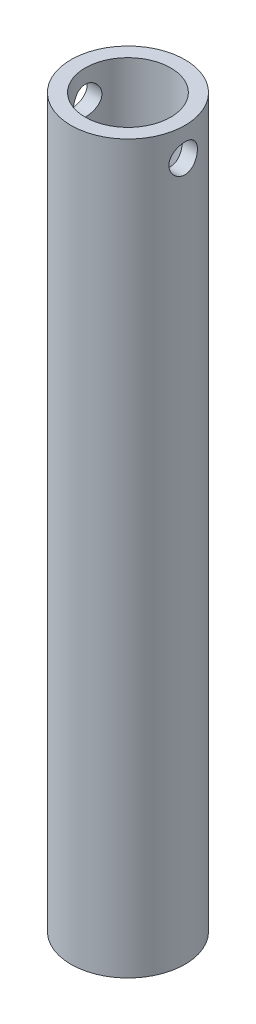
ISO-10303-21;
HEADER;
FILE_DESCRIPTION(('STEP AP214'),'2;1');
FILE_NAME('part.step','',(''),(''),'','','');
FILE_SCHEMA(('AUTOMOTIVE_DESIGN { 1 0 10303 214 1 1 1 1 }'));
ENDSEC;
DATA;
#1=APPLICATION_CONTEXT('core data for automotive mechanical design processes');
#2=APPLICATION_PROTOCOL_DEFINITION('international standard','automotive_design',2000,#1);
#3=PRODUCT_CONTEXT('',#1,'mechanical');
#4=PRODUCT('Part','Part','',(#3));
#5=PRODUCT_RELATED_PRODUCT_CATEGORY('part','',(#4));
#6=PRODUCT_DEFINITION_FORMATION('','',#4);
#7=PRODUCT_DEFINITION_CONTEXT('part definition',#1,'design');
#8=PRODUCT_DEFINITION('design','',#6,#7);
#9=PRODUCT_DEFINITION_SHAPE('','',#8);
#10=(LENGTH_UNIT() NAMED_UNIT(*) SI_UNIT(.MILLI.,.METRE.));
#11=(NAMED_UNIT(*) PLANE_ANGLE_UNIT() SI_UNIT($,.RADIAN.));
#12=(NAMED_UNIT(*) SI_UNIT($,.STERADIAN.) SOLID_ANGLE_UNIT());
#13=UNCERTAINTY_MEASURE_WITH_UNIT(LENGTH_MEASURE(1.E-05),#10,'distance_accuracy_value','');
#14=(GEOMETRIC_REPRESENTATION_CONTEXT(3) GLOBAL_UNCERTAINTY_ASSIGNED_CONTEXT((#13)) GLOBAL_UNIT_ASSIGNED_CONTEXT((#10,
#11,#12)) REPRESENTATION_CONTEXT('',''));
#15=CARTESIAN_POINT('',(0.,0.,0.));
#16=DIRECTION('',(0.,0.,1.));
#17=DIRECTION('',(1.,0.,0.));
#18=AXIS2_PLACEMENT_3D('',#15,#16,#17);
#19=CARTESIAN_POINT('',(0.,161.925,0.));
#20=DIRECTION('',(0.,1.,0.));
#21=DIRECTION('',(0.,0.,1.));
#22=AXIS2_PLACEMENT_3D('',#19,#20,#21);
#23=PLANE('',#22);
#24=CARTESIAN_POINT('',(0.,161.925,0.));
#25=DIRECTION('',(0.,1.,0.));
#26=DIRECTION('',(0.,0.,1.));
#27=AXIS2_PLACEMENT_3D('',#24,#25,#26);
#28=CIRCLE('',#27,12.7);
#29=CARTESIAN_POINT('',(0.,161.925,12.7));
#30=VERTEX_POINT('',#29);
#31=EDGE_CURVE('E10',#30,#30,#28,.T.);
#32=ORIENTED_EDGE('',*,*,#31,.T.);
#33=EDGE_LOOP('',(#32));
#34=FACE_BOUND('',#33,.T.);
#35=CARTESIAN_POINT('',(0.,161.925,0.));
#36=DIRECTION('',(0.,1.,0.));
#37=DIRECTION('',(0.,0.,1.));
#38=AXIS2_PLACEMENT_3D('',#35,#36,#37);
#39=CIRCLE('',#38,9.525);
#40=CARTESIAN_POINT('',(0.,161.925,9.525));
#41=VERTEX_POINT('',#40);
#42=EDGE_CURVE('E49',#41,#41,#39,.T.);
#43=ORIENTED_EDGE('',*,*,#42,.F.);
#44=EDGE_LOOP('',(#43));
#45=FACE_BOUND('',#44,.T.);
#46=ADVANCED_FACE('F31',(#34,#45),#23,.T.);
#47=CARTESIAN_POINT('',(0.,0.,0.));
#48=DIRECTION('',(0.,1.,0.));
#49=DIRECTION('',(0.,0.,1.));
#50=AXIS2_PLACEMENT_3D('',#47,#48,#49);
#51=PLANE('',#50);
#52=CARTESIAN_POINT('',(0.,0.,0.));
#53=DIRECTION('',(0.,1.,0.));
#54=DIRECTION('',(0.,0.,1.));
#55=AXIS2_PLACEMENT_3D('',#52,#53,#54);
#56=CIRCLE('',#55,12.7);
#57=CARTESIAN_POINT('',(0.,0.,12.7));
#58=VERTEX_POINT('',#57);
#59=EDGE_CURVE('E44',#58,#58,#56,.T.);
#60=ORIENTED_EDGE('',*,*,#59,.F.);
#61=EDGE_LOOP('',(#60));
#62=FACE_BOUND('',#61,.T.);
#63=CARTESIAN_POINT('',(0.,0.,0.));
#64=DIRECTION('',(0.,1.,0.));
#65=DIRECTION('',(0.,0.,1.));
#66=AXIS2_PLACEMENT_3D('',#63,#64,#65);
#67=CIRCLE('',#66,9.525);
#68=CARTESIAN_POINT('',(0.,0.,9.525));
#69=VERTEX_POINT('',#68);
#70=EDGE_CURVE('E52',#69,#69,#67,.T.);
#71=ORIENTED_EDGE('',*,*,#70,.T.);
#72=EDGE_LOOP('',(#71));
#73=FACE_BOUND('',#72,.T.);
#74=ADVANCED_FACE('F85',(#62,#73),#51,.F.);
#75=CARTESIAN_POINT('',(0.,161.925,0.));
#76=DIRECTION('',(0.,-1.,0.));
#77=DIRECTION('',(0.,0.,-1.));
#78=AXIS2_PLACEMENT_3D('',#75,#76,#77);
#79=CYLINDRICAL_SURFACE('',#78,12.7);
#80=CARTESIAN_POINT('',(-12.7,152.4,0.));
#81=CARTESIAN_POINT('',(-12.6999970338729,152.400004922812,-0.175421054350931));
#82=CARTESIAN_POINT('',(-12.6963292371237,152.414587115805,-0.350897100741782));
#83=CARTESIAN_POINT('',(-12.6820530760661,152.472443236933,-0.696820051980961));
#84=CARTESIAN_POINT('',(-12.6714407780562,152.515733426855,-0.867264049209733));
#85=CARTESIAN_POINT('',(-12.6444507573613,152.629529753161,-1.19807751278646));
#86=CARTESIAN_POINT('',(-12.6280799601569,152.700003207281,-1.35845880926017));
#87=CARTESIAN_POINT('',(-12.591316443928,152.866050608928,-1.66512267919771));
#88=CARTESIAN_POINT('',(-12.5709235892463,152.961625403118,-1.81140477687155));
#89=CARTESIAN_POINT('',(-12.5278602543575,153.177241671435,-2.08873074612027));
#90=CARTESIAN_POINT('',(-12.5051546346353,153.297702833663,-2.2194428772959));
#91=CARTESIAN_POINT('',(-12.4602582924963,153.558773833724,-2.45903522924702));
#92=CARTESIAN_POINT('',(-12.4380676284689,153.699385943571,-2.56791298487579));
#93=CARTESIAN_POINT('',(-12.3963594189446,153.999343229927,-2.76230618225783));
#94=CARTESIAN_POINT('',(-12.3768864828385,154.158935671878,-2.84745052370821));
#95=CARTESIAN_POINT('',(-12.343330973648,154.490734138014,-2.9895734564324));
#96=CARTESIAN_POINT('',(-12.3292475388652,154.662938140553,-3.04655655068163));
#97=CARTESIAN_POINT('',(-12.3084267567388,155.01142373786,-3.12960773790342));
#98=CARTESIAN_POINT('',(-12.3015478927701,155.187554529947,-3.15627230130284));
#99=CARTESIAN_POINT('',(-12.2954915053947,155.541913471049,-3.17978742389056));
#100=CARTESIAN_POINT('',(-12.2963127290578,155.720141274132,-3.176642833515));
#101=CARTESIAN_POINT('',(-12.3054365167726,156.069063459728,-3.14110481048737));
#102=CARTESIAN_POINT('',(-12.3135572669877,156.239835732102,-3.1094221534035));
#103=CARTESIAN_POINT('',(-12.3360753547043,156.573560891095,-3.01884119561133));
#104=CARTESIAN_POINT('',(-12.3504731393489,156.736513219745,-2.95994095604687));
#105=CARTESIAN_POINT('',(-12.3840899110031,157.051878801067,-2.81599106163371));
#106=CARTESIAN_POINT('',(-12.4033560981111,157.204169063621,-2.73068344564301));
#107=CARTESIAN_POINT('',(-12.4445122129068,157.492527935652,-2.53652078423163));
#108=CARTESIAN_POINT('',(-12.4664025994163,157.628593700076,-2.42766161831203));
#109=CARTESIAN_POINT('',(-12.5111061380944,157.884714319886,-2.18580424890856));
#110=CARTESIAN_POINT('',(-12.533927803951,158.004202003963,-2.05220624645105));
#111=CARTESIAN_POINT('',(-12.5773596047503,158.219184963215,-1.76659522538281));
#112=CARTESIAN_POINT('',(-12.5979696721291,158.314679505525,-1.6145816444818));
#113=CARTESIAN_POINT('',(-12.6347586626604,158.479173740842,-1.29564529770894));
#114=CARTESIAN_POINT('',(-12.6509221227036,158.548081303539,-1.12867311562491));
#115=CARTESIAN_POINT('',(-12.676884242985,158.656691630419,-0.785020883902428));
#116=CARTESIAN_POINT('',(-12.6866841206814,158.696399981085,-0.608342698201852));
#117=CARTESIAN_POINT('',(-12.6986347345774,158.744618513766,-0.255142937325549));
#118=CARTESIAN_POINT('',(-12.7009747992585,158.753901071859,-0.0787330573083703));
#119=CARTESIAN_POINT('',(-12.6982813685726,158.743122945649,0.273119584996531));
#120=CARTESIAN_POINT('',(-12.6932485369526,158.723064902742,0.448562432914398));
#121=CARTESIAN_POINT('',(-12.6764961338622,158.654811577238,0.790816868910241));
#122=CARTESIAN_POINT('',(-12.6648767569325,158.607037658974,0.957717835150525));
#123=CARTESIAN_POINT('',(-12.6362609570897,158.485190005473,1.28112793569116));
#124=CARTESIAN_POINT('',(-12.6192639911647,158.411113614204,1.43763601861911));
#125=CARTESIAN_POINT('',(-12.5813250177716,158.237266860549,1.73889063454314));
#126=CARTESIAN_POINT('',(-12.5603183592593,158.137063895427,1.88337918521904));
#127=CARTESIAN_POINT('',(-12.5167921111412,157.914361359713,2.15376466554501));
#128=CARTESIAN_POINT('',(-12.4942722608556,157.791857941143,2.27965837982672));
#129=CARTESIAN_POINT('',(-12.4495762556412,157.524445849547,2.51246336908675));
#130=CARTESIAN_POINT('',(-12.4274221051899,157.379061028651,2.6188328531313));
#131=CARTESIAN_POINT('',(-12.3865825924258,157.072049257042,2.80566443991221));
#132=CARTESIAN_POINT('',(-12.3678970761538,156.910423027713,2.88612769264177));
#133=CARTESIAN_POINT('',(-12.3363163381503,156.576382887573,3.0182638402854));
#134=CARTESIAN_POINT('',(-12.3233869021911,156.404039853404,3.07010730622842));
#135=CARTESIAN_POINT('',(-12.3047494152553,156.052711266541,3.1439816468797));
#136=CARTESIAN_POINT('',(-12.299039785006,155.873727175344,3.16601904149253));
#137=CARTESIAN_POINT('',(-12.2956087422145,155.51971049948,3.17931501621074));
#138=CARTESIAN_POINT('',(-12.2976625750886,155.344712095613,3.17143955029538));
#139=CARTESIAN_POINT('',(-12.3090074061494,154.998623435624,3.1271152390873));
#140=CARTESIAN_POINT('',(-12.3182982588945,154.827533101033,3.09066696801937));
#141=CARTESIAN_POINT('',(-12.3429450180984,154.495058761656,2.99070462615689));
#142=CARTESIAN_POINT('',(-12.3582644892528,154.333623037245,2.92735297324092));
#143=CARTESIAN_POINT('',(-12.3932474960913,154.023556606586,2.77551073379659));
#144=CARTESIAN_POINT('',(-12.4129116342002,153.874927680087,2.68701666057214));
#145=CARTESIAN_POINT('',(-12.4550092586011,153.590509368613,2.48468673461549));
#146=CARTESIAN_POINT('',(-12.4775016056118,153.455156061253,2.37025002816432));
#147=CARTESIAN_POINT('',(-12.5223699100401,153.205292088516,2.12045416901819));
#148=CARTESIAN_POINT('',(-12.5447458385544,153.090786379594,1.98509005500273));
#149=CARTESIAN_POINT('',(-12.5873437112106,152.883846063538,1.69432305852049));
#150=CARTESIAN_POINT('',(-12.6075193062447,152.791848734395,1.53860166056968));
#151=CARTESIAN_POINT('',(-12.6429542453062,152.635484536776,1.21341315929717));
#152=CARTESIAN_POINT('',(-12.6582171100619,152.571097869961,1.04395600927443));
#153=CARTESIAN_POINT('',(-12.6798505941374,152.481339625802,0.729001702698686));
#154=CARTESIAN_POINT('',(-12.6873547169486,152.450903202204,0.58500469508875));
#155=CARTESIAN_POINT('',(-12.6974304774096,152.410232086,0.29401785141847));
#156=CARTESIAN_POINT('',(-12.7000024860439,152.39999587397,0.147028241296873));
#157=CARTESIAN_POINT('',(-12.7,152.4,0.));
#158=B_SPLINE_CURVE_WITH_KNOTS('',3,(#80,#81,#82,#83,#84,#85,#86,#87,#88,#89,#90,#91,#92,#93,
#94,#95,#96,#97,#98,#99,#100,#101,#102,#103,#104,#105,#106,#107,#108,#109,#110,#111,#112,#113,
#114,#115,#116,#117,#118,#119,#120,#121,#122,#123,#124,#125,#126,#127,#128,#129,#130,#131,#132,
#133,#134,#135,#136,#137,#138,#139,#140,#141,#142,#143,#144,#145,#146,#147,#148,#149,#150,#151,
#152,#153,#154,#155,#156,#157),.UNSPECIFIED.,.T.,.F.,(4,2,2,2,2,2,2,2,2,2,2,2,2,2,2,2,2,2,2,2,2,
2,2,2,2,2,2,2,2,2,2,2,2,2,2,2,2,2,4),(0.,0.525724358065498,1.05174676993359,1.57713870983893,
2.10254837335841,2.63767221675278,3.17285644277796,3.7159913730529,4.25903942808498,
4.79120824630598,5.3232904734557,5.84247618671886,6.36169889010144,6.8861628400674,
7.41071862276906,7.95023177058124,8.48976139571985,9.0311441807632,9.57242335981323,
10.09985087283,10.6272309069567,11.1467958106174,11.6664131950588,12.1952509368702,
12.7241800170733,13.266092111565,13.8079801469349,14.34660272276,14.885107458967,
15.4081433519175,15.9311687337377,16.4510804786766,16.971064359066,17.5046127008448,
18.0382877269755,18.5816279265762,19.1245778677202,19.5652441424438,20.005877269746),.UNSPECIFIED.);
#159=CARTESIAN_POINT('',(-12.7,152.4,0.));
#160=VERTEX_POINT('',#159);
#161=EDGE_CURVE('E75',#160,#160,#158,.T.);
#162=ORIENTED_EDGE('',*,*,#161,.T.);
#163=EDGE_LOOP('',(#162));
#164=FACE_BOUND('',#163,.T.);
#165=CARTESIAN_POINT('',(12.2967221242086,155.575,-3.175));
#166=CARTESIAN_POINT('',(12.2967254711158,155.399675546323,-3.1749950198132));
#167=CARTESIAN_POINT('',(12.3005126863854,155.224295978678,-3.16042833178201));
#168=CARTESIAN_POINT('',(12.3152136473056,154.87857317572,-3.10263936933901));
#169=CARTESIAN_POINT('',(12.3261315404947,154.708232931825,-3.05940041756247));
#170=CARTESIAN_POINT('',(12.3537818023711,154.377639506502,-2.94575382353269));
#171=CARTESIAN_POINT('',(12.3705066621688,154.21737361266,-2.8753812543752));
#172=CARTESIAN_POINT('',(12.4078770387652,153.910905217274,-2.70957184940195));
#173=CARTESIAN_POINT('',(12.4285227220068,153.764703313158,-2.61413394947206));
#174=CARTESIAN_POINT('',(12.4719170977164,153.487295710517,-2.39865970268607));
#175=CARTESIAN_POINT('',(12.4946993898125,153.356445127555,-2.27817284738413));
#176=CARTESIAN_POINT('',(12.5395085190442,153.116583029162,-2.01699122140783));
#177=CARTESIAN_POINT('',(12.5615352853931,153.00757355546,-1.87629456360899));
#178=CARTESIAN_POINT('',(12.6027232771114,152.813035156108,-1.57625440537027));
#179=CARTESIAN_POINT('',(12.6218402299875,152.727855087035,-1.4166781117678));
#180=CARTESIAN_POINT('',(12.65467131146,152.585661751926,-1.08491424405179));
#181=CARTESIAN_POINT('',(12.6683862371462,152.528644330067,-0.912728534955745));
#182=CARTESIAN_POINT('',(12.6886304373719,152.445532250085,-0.564335623617766));
#183=CARTESIAN_POINT('',(12.6952996518228,152.418834551705,-0.388280553827183));
#184=CARTESIAN_POINT('',(12.7011886451627,152.39522685832,-0.0340726004637068));
#185=CARTESIAN_POINT('',(12.7004095254281,152.398312459294,0.144079969063354));
#186=CARTESIAN_POINT('',(12.6915938059099,152.433750059818,0.493243384772338));
#187=CARTESIAN_POINT('',(12.6837186297291,152.465451132818,0.664324984533399));
#188=CARTESIAN_POINT('',(12.6617836238657,152.556173512962,0.998658935538464));
#189=CARTESIAN_POINT('',(12.6477234649603,152.615196274429,1.16191086950115));
#190=CARTESIAN_POINT('',(12.6147513732012,152.759413264773,1.47766628361824));
#191=CARTESIAN_POINT('',(12.5957967501266,152.84483914672,1.63005931850867));
#192=CARTESIAN_POINT('',(12.5550917783831,153.039261712478,1.91857510093107));
#193=CARTESIAN_POINT('',(12.5333409435886,153.148262497072,2.05469501139649));
#194=CARTESIAN_POINT('',(12.4887191648708,153.390230102318,2.31068256139474));
#195=CARTESIAN_POINT('',(12.4658338379713,153.523765713282,2.43001063106375));
#196=CARTESIAN_POINT('',(12.4220610526701,153.809191966396,2.6446999936826));
#197=CARTESIAN_POINT('',(12.4011736876753,153.961083465954,2.74006016644614));
#198=CARTESIAN_POINT('',(12.3637103097323,154.279968343369,2.90445230964672));
#199=CARTESIAN_POINT('',(12.347155693206,154.447031377497,2.97335437513118));
#200=CARTESIAN_POINT('',(12.3205067298881,154.790883544458,3.08192684552051));
#201=CARTESIAN_POINT('',(12.3104110007027,154.96767058726,3.12160350580598));
#202=CARTESIAN_POINT('',(12.2981130212947,155.320948566943,3.16970364110572));
#203=CARTESIAN_POINT('',(12.2957093300071,155.497323997543,3.17892490187728));
#204=CARTESIAN_POINT('',(12.2985192607316,155.849093859463,3.16803657795425));
#205=CARTESIAN_POINT('',(12.3037321815428,156.024488379596,3.14792969326924));
#206=CARTESIAN_POINT('',(12.3209949412092,156.366355116485,3.07965533920158));
#207=CARTESIAN_POINT('',(12.3329315220802,156.532926362743,3.03195236671801));
#208=CARTESIAN_POINT('',(12.3621891219376,156.855707951474,2.91035496372148));
#209=CARTESIAN_POINT('',(12.3795107787294,157.011917064001,2.83645743059487));
#210=CARTESIAN_POINT('',(12.418010941113,157.312920422891,2.66289874827947));
#211=CARTESIAN_POINT('',(12.439258441312,157.457430626855,2.56276062737125));
#212=CARTESIAN_POINT('',(12.4830469550031,157.727889220758,2.34016643006687));
#213=CARTESIAN_POINT('',(12.5055881806495,157.853834554146,2.21770668600725));
#214=CARTESIAN_POINT('',(12.5501070185035,158.086820024065,1.95028413912649));
#215=CARTESIAN_POINT('',(12.5720564161859,158.193308279437,1.80483494928779));
#216=CARTESIAN_POINT('',(12.6123346509939,158.380348551028,1.49765601755557));
#217=CARTESIAN_POINT('',(12.6306636769502,158.460901920092,1.33592712544033));
#218=CARTESIAN_POINT('',(12.6615204698767,158.59308646385,1.0018972904962));
#219=CARTESIAN_POINT('',(12.6740898412846,158.644925641161,0.829682684763512));
#220=CARTESIAN_POINT('',(12.6921932261265,158.718834624953,0.478630489012201));
#221=CARTESIAN_POINT('',(12.6977285972965,158.740910176599,0.299794184005929));
#222=CARTESIAN_POINT('',(12.7010848787296,158.754342096902,-0.0542401964575578));
#223=CARTESIAN_POINT('',(12.6991103294396,158.746512926378,-0.229405900617125));
#224=CARTESIAN_POINT('',(12.6881222125238,158.70222314834,-0.57584180111684));
#225=CARTESIAN_POINT('',(12.6791088542401,158.665763392333,-0.747112113154457));
#226=CARTESIAN_POINT('',(12.655087493111,158.565684202227,-1.08004303817217));
#227=CARTESIAN_POINT('',(12.640112022951,158.502212035727,-1.24175042029425));
#228=CARTESIAN_POINT('',(12.6057434230086,158.350043411613,-1.55231164340717));
#229=CARTESIAN_POINT('',(12.5863497364056,158.261343774271,-1.7011638610184));
#230=CARTESIAN_POINT('',(12.5446551773491,158.058754132062,-1.985651122744));
#231=CARTESIAN_POINT('',(12.5222957878978,157.94431154628,-2.12088408784723));
#232=CARTESIAN_POINT('',(12.4774531075658,157.694557444972,-2.37050268936839));
#233=CARTESIAN_POINT('',(12.4549697867118,157.559240646347,-2.48488303211818));
#234=CARTESIAN_POINT('',(12.4119473580947,157.268540509948,-2.69164443404807));
#235=CARTESIAN_POINT('',(12.3914523466269,157.112829908315,-2.78357526664701));
#236=CARTESIAN_POINT('',(12.3553205869608,156.787673819647,-2.93981789665887));
#237=CARTESIAN_POINT('',(12.3396803064045,156.618238432652,-3.00414978846309));
#238=CARTESIAN_POINT('',(12.3174731028359,156.303417987423,-3.09379152821294));
#239=CARTESIAN_POINT('',(12.3097500503611,156.159539203074,-3.12417831664509));
#240=CARTESIAN_POINT('',(12.2993733749982,155.868786340932,-3.16478377891537));
#241=CARTESIAN_POINT('',(12.2967193196792,155.721912519724,-3.1750041731303));
#242=CARTESIAN_POINT('',(12.2967221242086,155.575,-3.175));
#243=B_SPLINE_CURVE_WITH_KNOTS('',3,(#165,#166,#167,#168,#169,#170,#171,#172,#173,#174,#175,
#176,#177,#178,#179,#180,#181,#182,#183,#184,#185,#186,#187,#188,#189,#190,#191,#192,#193,#194,
#195,#196,#197,#198,#199,#200,#201,#202,#203,#204,#205,#206,#207,#208,#209,#210,#211,#212,#213,
#214,#215,#216,#217,#218,#219,#220,#221,#222,#223,#224,#225,#226,#227,#228,#229,#230,#231,#232,
#233,#234,#235,#236,#237,#238,#239,#240,#241,#242),.UNSPECIFIED.,.T.,.F.,(4,2,2,2,2,2,2,2,2,2,2,
2,2,2,2,2,2,2,2,2,2,2,2,2,2,2,2,2,2,2,2,2,2,2,2,2,2,2,4),(0.,0.525433851004907,1.05117359161441,
1.57623602350084,2.10132074979461,2.63682421825082,3.1723777227943,3.71540400425359,
4.25835013005809,4.79029713764091,5.32216548805846,5.84223193614963,6.36232607040479,
6.88711950303145,7.41200429545521,7.95109492546329,8.4902107462375,9.03194068650673,
9.57355464164526,10.1008633995054,10.6281236152971,11.1467570436797,11.6654519221148,
12.1943221424741,12.7232793399029,13.2654717033224,13.8076357797011,14.3458193247108,
14.8838989712076,15.4074297658815,15.9309449907505,16.4516419323711,16.9724045329363,
17.5056431266551,18.0390169009448,18.5823412615974,19.1252693614627,19.5655924052587,
20.0058778838705),.UNSPECIFIED.);
#244=CARTESIAN_POINT('',(12.2967221242086,155.575,-3.175));
#245=VERTEX_POINT('',#244);
#246=EDGE_CURVE('E71',#245,#245,#243,.T.);
#247=ORIENTED_EDGE('',*,*,#246,.T.);
#248=EDGE_LOOP('',(#247));
#249=FACE_BOUND('',#248,.T.);
#250=ORIENTED_EDGE('',*,*,#31,.F.);
#251=EDGE_LOOP('',(#250));
#252=FACE_BOUND('',#251,.T.);
#253=ORIENTED_EDGE('',*,*,#59,.T.);
#254=EDGE_LOOP('',(#253));
#255=FACE_BOUND('',#254,.T.);
#256=ADVANCED_FACE('F33',(#164,#249,#252,#255),#79,.T.);
#257=CARTESIAN_POINT('',(0.,161.925,0.));
#258=DIRECTION('',(0.,-1.,0.));
#259=DIRECTION('',(0.,0.,-1.));
#260=AXIS2_PLACEMENT_3D('',#257,#258,#259);
#261=CYLINDRICAL_SURFACE('',#260,9.525);
#262=CARTESIAN_POINT('',(-8.98025612106915,155.575,-3.175));
#263=CARTESIAN_POINT('',(-8.98025555134128,155.747936455105,-3.17500081898399));
#264=CARTESIAN_POINT('',(-8.98530617498472,155.92086798944,-3.16082293820153));
#265=CARTESIAN_POINT('',(-9.00485797707984,156.261607786657,-3.10467734311196));
#266=CARTESIAN_POINT('',(-9.01936071226449,156.429415200845,-3.06270505113466));
#267=CARTESIAN_POINT('',(-9.05599546711913,156.754915385266,-2.95260866704957));
#268=CARTESIAN_POINT('',(-9.07811252608946,156.912627275981,-2.8845358279553));
#269=CARTESIAN_POINT('',(-9.12746212382781,157.21444315414,-2.72434567030138));
#270=CARTESIAN_POINT('',(-9.15469579088969,157.358544129608,-2.63222304663107));
#271=CARTESIAN_POINT('',(-9.21240503868728,157.634685880424,-2.42268738995613));
#272=CARTESIAN_POINT('',(-9.24296141131745,157.766116486033,-2.30449228387489));
#273=CARTESIAN_POINT('',(-9.30319020743184,158.007706593888,-2.0478358434057));
#274=CARTESIAN_POINT('',(-9.33286248831953,158.117862680274,-1.90937126079128));
#275=CARTESIAN_POINT('',(-9.38891527476712,158.316545499021,-1.61164431278889));
#276=CARTESIAN_POINT('',(-9.41518969452598,158.404432906712,-1.45193356813785));
#277=CARTESIAN_POINT('',(-9.46053437997871,158.55185328278,-1.1189691329852));
#278=CARTESIAN_POINT('',(-9.47960658694531,158.611393892837,-0.945719107056871));
#279=CARTESIAN_POINT('',(-9.50782564496303,158.698361338458,-0.596991495351317));
#280=CARTESIAN_POINT('',(-9.5172947441875,158.726833441866,-0.421801146658148));
#281=CARTESIAN_POINT('',(-9.52638456092937,158.75417923142,-0.0688907525664608));
#282=CARTESIAN_POINT('',(-9.52600781684693,158.753060546496,0.108828629001892));
#283=CARTESIAN_POINT('',(-9.51566675789472,158.721919491753,0.454353660740383));
#284=CARTESIAN_POINT('',(-9.50607905597497,158.693032472093,0.622274754278533));
#285=CARTESIAN_POINT('',(-9.47886621303647,158.609052285387,0.950732918260416));
#286=CARTESIAN_POINT('',(-9.46124052729002,158.553957342239,1.11126948744903));
#287=CARTESIAN_POINT('',(-9.41945253180987,158.418462317553,1.42288410762328));
#288=CARTESIAN_POINT('',(-9.39520735013749,158.337739145115,1.5738101015761));
#289=CARTESIAN_POINT('',(-9.34270397898567,158.1535454352,1.86030973354927));
#290=CARTESIAN_POINT('',(-9.31444467439657,158.050068572435,1.99587908667347));
#291=CARTESIAN_POINT('',(-9.25532159123421,157.817583800765,2.25457025130041));
#292=CARTESIAN_POINT('',(-9.22439783161187,157.687603223853,2.37680549868224));
#293=CARTESIAN_POINT('',(-9.1645528941526,157.408725295818,2.5980302992242));
#294=CARTESIAN_POINT('',(-9.13563202542329,157.259825034813,2.69701626991891));
#295=CARTESIAN_POINT('',(-9.08273917259531,156.944524738709,2.87016016973849));
#296=CARTESIAN_POINT('',(-9.05884361979074,156.777905483066,2.94394402199775));
#297=CARTESIAN_POINT('',(-9.01959241367421,156.433610823369,3.06210713863014));
#298=CARTESIAN_POINT('',(-9.00423318171519,156.25594008717,3.10649872649829));
#299=CARTESIAN_POINT('',(-8.98460345301982,155.903173221568,3.16281207065963));
#300=CARTESIAN_POINT('',(-8.9798639401205,155.728322576423,3.17610837823673));
#301=CARTESIAN_POINT('',(-8.9806993378791,155.378860726563,3.17374726853835));
#302=CARTESIAN_POINT('',(-8.98627237514011,155.204249484124,3.15809511009497));
#303=CARTESIAN_POINT('',(-9.00663737436701,154.866476633865,3.09951644367858));
#304=CARTESIAN_POINT('',(-9.02110608274668,154.703127759271,3.05754530088867));
#305=CARTESIAN_POINT('',(-9.05727657905498,154.385824050191,2.94866651362947));
#306=CARTESIAN_POINT('',(-9.07897964918116,154.231870886699,2.88175444845385));
#307=CARTESIAN_POINT('',(-9.12802586366624,153.932317163811,2.72248103184611));
#308=CARTESIAN_POINT('',(-9.1555260648837,153.787136409612,2.62937980078822));
#309=CARTESIAN_POINT('',(-9.21276315720814,153.513961283682,2.42120937702025));
#310=CARTESIAN_POINT('',(-9.24250070609047,153.385971997251,2.30613370845863));
#311=CARTESIAN_POINT('',(-9.30259247675171,153.144448650512,2.05070616623353));
#312=CARTESIAN_POINT('',(-9.33290753359821,153.03190631169,1.90940458398561));
#313=CARTESIAN_POINT('',(-9.3893275387162,152.832066248045,1.6091766501958));
#314=CARTESIAN_POINT('',(-9.41543263651181,152.744767626559,1.45025092494494));
#315=CARTESIAN_POINT('',(-9.46036988448665,152.598691167064,1.12007606322252));
#316=CARTESIAN_POINT('',(-9.47924920264386,152.539727695055,0.948915816544785));
#317=CARTESIAN_POINT('',(-9.50781089409934,152.451664418959,0.598355629061085));
#318=CARTESIAN_POINT('',(-9.51749658708009,152.422553835129,0.418958686953577));
#319=CARTESIAN_POINT('',(-9.52632915775114,152.395992903602,0.0660886913556059));
#320=CARTESIAN_POINT('',(-9.52594996283969,152.397118833765,-0.107266498446081));
#321=CARTESIAN_POINT('',(-9.51586223949088,152.427486953365,-0.451202885375571));
#322=CARTESIAN_POINT('',(-9.50615446789103,152.456726861885,-0.621784306400523));
#323=CARTESIAN_POINT('',(-9.47867404980259,152.541548594779,-0.952633729196804));
#324=CARTESIAN_POINT('',(-9.46103195296646,152.596704633746,-1.11302251014812));
#325=CARTESIAN_POINT('',(-9.41949985236771,152.731398661233,-1.42233126423387));
#326=CARTESIAN_POINT('',(-9.39560871852452,152.810941060251,-1.57124915665223));
#327=CARTESIAN_POINT('',(-9.34294133528522,152.995533200924,-1.8593880017804));
#328=CARTESIAN_POINT('',(-9.31401720161866,153.101416826087,-1.99804734869542));
#329=CARTESIAN_POINT('',(-9.25490239414217,153.334267216921,-2.25609475841497));
#330=CARTESIAN_POINT('',(-9.22471131854583,153.461240709184,-2.37547664865809));
#331=CARTESIAN_POINT('',(-9.16505913446274,153.738609703989,-2.59633024304515));
#332=CARTESIAN_POINT('',(-9.13567286363902,153.889727497351,-2.69691791704334));
#333=CARTESIAN_POINT('',(-9.08241113800573,154.207636805416,-2.87119803998104));
#334=CARTESIAN_POINT('',(-9.05853424386966,154.374424210369,-2.94489751640183));
#335=CARTESIAN_POINT('',(-9.02021736105684,154.71127879125,-3.06020415454822));
#336=CARTESIAN_POINT('',(-9.00539959321553,154.880856936693,-3.10311136154972));
#337=CARTESIAN_POINT('',(-8.9854209273797,155.225292960232,-3.16050396647392));
#338=CARTESIAN_POINT('',(-8.98025669710439,155.400148995279,-3.17499917194918));
#339=CARTESIAN_POINT('',(-8.98025612106915,155.575,-3.175));
#340=B_SPLINE_CURVE_WITH_KNOTS('',3,(#262,#263,#264,#265,#266,#267,#268,#269,#270,#271,#272,
#273,#274,#275,#276,#277,#278,#279,#280,#281,#282,#283,#284,#285,#286,#287,#288,#289,#290,#291,
#292,#293,#294,#295,#296,#297,#298,#299,#300,#301,#302,#303,#304,#305,#306,#307,#308,#309,#310,
#311,#312,#313,#314,#315,#316,#317,#318,#319,#320,#321,#322,#323,#324,#325,#326,#327,#328,#329,
#330,#331,#332,#333,#334,#335,#336,#337,#338,#339),.UNSPECIFIED.,.T.,.F.,(4,2,2,2,2,2,2,2,2,2,2,
2,2,2,2,2,2,2,2,2,2,2,2,2,2,2,2,2,2,2,2,2,2,2,2,2,2,2,4),(0.,0.518161856737954,1.03640907467316,
1.55364379231514,2.07099270263877,2.60671746332529,3.14252816921063,3.69231882006114,
4.24196117528058,4.77247962078669,5.30286129234891,5.81244090321183,6.32205505300828,
6.83836754181566,7.35482374200021,7.89559553605438,8.43645060268438,8.985016315017,
9.53335188057254,10.0569487508209,10.5804505128322,11.0859695656586,11.5915782629155,
12.1132237331089,12.6350231697725,13.1819271594322,13.7288117205517,14.2720628703095,
14.815117785382,15.3326491885149,15.8501386073106,16.3594083542837,16.868770261733,
17.3969527447801,17.9253040157361,18.4743376618726,19.023227709973,19.5473069861654,
20.0712053232972),.UNSPECIFIED.);
#341=CARTESIAN_POINT('',(-8.98025612106915,155.575,-3.175));
#342=VERTEX_POINT('',#341);
#343=EDGE_CURVE('E36',#342,#342,#340,.T.);
#344=ORIENTED_EDGE('',*,*,#343,.F.);
#345=EDGE_LOOP('',(#344));
#346=FACE_BOUND('',#345,.T.);
#347=CARTESIAN_POINT('',(8.98025612106915,155.575,-3.175));
#348=CARTESIAN_POINT('',(8.98025555134128,155.402063544895,-3.17500081898399));
#349=CARTESIAN_POINT('',(8.98530617498472,155.22913201056,-3.16082293820153));
#350=CARTESIAN_POINT('',(9.00485797707984,154.888392213343,-3.10467734311197));
#351=CARTESIAN_POINT('',(9.01936071226449,154.720584799155,-3.06270505113466));
#352=CARTESIAN_POINT('',(9.05599546711913,154.395084614734,-2.95260866704956));
#353=CARTESIAN_POINT('',(9.07811252608947,154.237372724019,-2.88453582795529));
#354=CARTESIAN_POINT('',(9.12746212382781,153.93555684586,-2.72434567030137));
#355=CARTESIAN_POINT('',(9.15469579088969,153.791455870392,-2.63222304663107));
#356=CARTESIAN_POINT('',(9.21240503868728,153.515314119576,-2.42268738995613));
#357=CARTESIAN_POINT('',(9.24296141131745,153.383883513967,-2.30449228387489));
#358=CARTESIAN_POINT('',(9.30319020743184,153.142293406112,-2.0478358434057));
#359=CARTESIAN_POINT('',(9.33286248831953,153.032137319726,-1.90937126079128));
#360=CARTESIAN_POINT('',(9.38891527476712,152.833454500979,-1.61164431278889));
#361=CARTESIAN_POINT('',(9.41518969452598,152.745567093288,-1.45193356813785));
#362=CARTESIAN_POINT('',(9.46053437997871,152.59814671722,-1.1189691329852));
#363=CARTESIAN_POINT('',(9.47960658694531,152.538606107163,-0.945719107056871));
#364=CARTESIAN_POINT('',(9.50782564496303,152.451638661542,-0.596991495351317));
#365=CARTESIAN_POINT('',(9.5172947441875,152.423166558134,-0.421801146658148));
#366=CARTESIAN_POINT('',(9.52638456092937,152.39582076858,-0.0688907525664608));
#367=CARTESIAN_POINT('',(9.52600781684693,152.396939453504,0.108828629001892));
#368=CARTESIAN_POINT('',(9.51566675789472,152.428080508247,0.454353660740383));
#369=CARTESIAN_POINT('',(9.50607905597497,152.456967527906,0.622274754278533));
#370=CARTESIAN_POINT('',(9.47886621303647,152.540947714613,0.950732918260416));
#371=CARTESIAN_POINT('',(9.46124052729002,152.596042657761,1.11126948744903));
#372=CARTESIAN_POINT('',(9.41945253180987,152.731537682447,1.42288410762328));
#373=CARTESIAN_POINT('',(9.39520735013749,152.812260854885,1.5738101015761));
#374=CARTESIAN_POINT('',(9.34270397898567,152.996454564799,1.86030973354927));
#375=CARTESIAN_POINT('',(9.31444467439657,153.099931427565,1.99587908667347));
#376=CARTESIAN_POINT('',(9.25532159123421,153.332416199235,2.25457025130041));
#377=CARTESIAN_POINT('',(9.22439783161187,153.462396776147,2.37680549868224));
#378=CARTESIAN_POINT('',(9.1645528941526,153.741274704182,2.5980302992242));
#379=CARTESIAN_POINT('',(9.13563202542329,153.890174965187,2.69701626991891));
#380=CARTESIAN_POINT('',(9.08273917259531,154.205475261291,2.87016016973849));
#381=CARTESIAN_POINT('',(9.05884361979074,154.372094516934,2.94394402199776));
#382=CARTESIAN_POINT('',(9.01959241367421,154.716389176631,3.06210713863014));
#383=CARTESIAN_POINT('',(9.00423318171519,154.89405991283,3.10649872649829));
#384=CARTESIAN_POINT('',(8.98460345301983,155.246826778432,3.16281207065963));
#385=CARTESIAN_POINT('',(8.9798639401205,155.421677423577,3.17610837823673));
#386=CARTESIAN_POINT('',(8.9806993378791,155.771139273437,3.17374726853835));
#387=CARTESIAN_POINT('',(8.98627237514011,155.945750515876,3.15809511009497));
#388=CARTESIAN_POINT('',(9.00663737436701,156.283523366135,3.09951644367858));
#389=CARTESIAN_POINT('',(9.02110608274668,156.446872240729,3.05754530088867));
#390=CARTESIAN_POINT('',(9.05727657905498,156.764175949809,2.94866651362947));
#391=CARTESIAN_POINT('',(9.07897964918116,156.918129113301,2.88175444845385));
#392=CARTESIAN_POINT('',(9.12802586366624,157.217682836189,2.72248103184611));
#393=CARTESIAN_POINT('',(9.1555260648837,157.362863590388,2.62937980078822));
#394=CARTESIAN_POINT('',(9.21276315720814,157.636038716318,2.42120937702025));
#395=CARTESIAN_POINT('',(9.24250070609047,157.764028002749,2.30613370845863));
#396=CARTESIAN_POINT('',(9.30259247675171,158.005551349488,2.05070616623353));
#397=CARTESIAN_POINT('',(9.33290753359821,158.11809368831,1.90940458398561));
#398=CARTESIAN_POINT('',(9.3893275387162,158.317933751955,1.6091766501958));
#399=CARTESIAN_POINT('',(9.41543263651181,158.405232373441,1.45025092494494));
#400=CARTESIAN_POINT('',(9.46036988448665,158.551308832936,1.12007606322252));
#401=CARTESIAN_POINT('',(9.47924920264386,158.610272304945,0.948915816544785));
#402=CARTESIAN_POINT('',(9.50781089409934,158.698335581041,0.598355629061085));
#403=CARTESIAN_POINT('',(9.51749658708009,158.727446164871,0.418958686953577));
#404=CARTESIAN_POINT('',(9.52632915775114,158.754007096398,0.0660886913556059));
#405=CARTESIAN_POINT('',(9.52594996283969,158.752881166235,-0.10726649844608));
#406=CARTESIAN_POINT('',(9.51586223949088,158.722513046635,-0.451202885375571));
#407=CARTESIAN_POINT('',(9.50615446789103,158.693273138115,-0.621784306400523));
#408=CARTESIAN_POINT('',(9.47867404980259,158.608451405221,-0.952633729196801));
#409=CARTESIAN_POINT('',(9.46103195296646,158.553295366254,-1.11302251014812));
#410=CARTESIAN_POINT('',(9.41949985236771,158.418601338767,-1.42233126423386));
#411=CARTESIAN_POINT('',(9.39560871852452,158.339058939749,-1.57124915665223));
#412=CARTESIAN_POINT('',(9.34294133528522,158.154466799076,-1.8593880017804));
#413=CARTESIAN_POINT('',(9.31401720161866,158.048583173913,-1.99804734869542));
#414=CARTESIAN_POINT('',(9.25490239414217,157.815732783079,-2.25609475841497));
#415=CARTESIAN_POINT('',(9.22471131854583,157.688759290816,-2.37547664865809));
#416=CARTESIAN_POINT('',(9.16505913446274,157.411390296011,-2.59633024304515));
#417=CARTESIAN_POINT('',(9.13567286363902,157.260272502649,-2.69691791704334));
#418=CARTESIAN_POINT('',(9.08241113800573,156.942363194584,-2.87119803998104));
#419=CARTESIAN_POINT('',(9.05853424386966,156.775575789631,-2.94489751640183));
#420=CARTESIAN_POINT('',(9.02021736105684,156.43872120875,-3.06020415454822));
#421=CARTESIAN_POINT('',(9.00539959321553,156.269143063307,-3.10311136154972));
#422=CARTESIAN_POINT('',(8.9854209273797,155.924707039768,-3.16050396647392));
#423=CARTESIAN_POINT('',(8.98025669710439,155.749851004721,-3.17499917194918));
#424=CARTESIAN_POINT('',(8.98025612106915,155.575,-3.175));
#425=B_SPLINE_CURVE_WITH_KNOTS('',3,(#347,#348,#349,#350,#351,#352,#353,#354,#355,#356,#357,
#358,#359,#360,#361,#362,#363,#364,#365,#366,#367,#368,#369,#370,#371,#372,#373,#374,#375,#376,
#377,#378,#379,#380,#381,#382,#383,#384,#385,#386,#387,#388,#389,#390,#391,#392,#393,#394,#395,
#396,#397,#398,#399,#400,#401,#402,#403,#404,#405,#406,#407,#408,#409,#410,#411,#412,#413,#414,
#415,#416,#417,#418,#419,#420,#421,#422,#423,#424),.UNSPECIFIED.,.T.,.F.,(4,2,2,2,2,2,2,2,2,2,2,
2,2,2,2,2,2,2,2,2,2,2,2,2,2,2,2,2,2,2,2,2,2,2,2,2,2,2,4),(0.,0.518161856737954,1.03640907467316,
1.55364379231514,2.07099270263877,2.60671746332529,3.14252816921063,3.69231882006113,
4.24196117528058,4.77247962078668,5.30286129234891,5.81244090321183,6.32205505300828,
6.83836754181566,7.35482374200021,7.89559553605437,8.43645060268438,8.98501631501702,
9.53335188057253,10.0569487508209,10.5804505128322,11.0859695656586,11.5915782629155,
12.1132237331089,12.6350231697725,13.1819271594322,13.7288117205516,14.2720628703095,
14.815117785382,15.3326491885149,15.8501386073105,16.3594083542836,16.868770261733,
17.3969527447801,17.9253040157361,18.4743376618726,19.023227709973,19.5473069861654,
20.0712053232972),.UNSPECIFIED.);
#426=CARTESIAN_POINT('',(8.98025612106915,155.575,-3.175));
#427=VERTEX_POINT('',#426);
#428=EDGE_CURVE('E54',#427,#427,#425,.T.);
#429=ORIENTED_EDGE('',*,*,#428,.F.);
#430=EDGE_LOOP('',(#429));
#431=FACE_BOUND('',#430,.T.);
#432=ORIENTED_EDGE('',*,*,#42,.T.);
#433=EDGE_LOOP('',(#432));
#434=FACE_BOUND('',#433,.T.);
#435=ORIENTED_EDGE('',*,*,#70,.F.);
#436=EDGE_LOOP('',(#435));
#437=FACE_BOUND('',#436,.T.);
#438=ADVANCED_FACE('F58',(#346,#431,#434,#437),#261,.F.);
#439=CARTESIAN_POINT('',(-12.7,155.575,0.));
#440=DIRECTION('',(1.,0.,0.));
#441=DIRECTION('',(0.,0.,-1.));
#442=AXIS2_PLACEMENT_3D('',#439,#440,#441);
#443=CYLINDRICAL_SURFACE('',#442,3.175);
#444=ORIENTED_EDGE('',*,*,#428,.T.);
#445=EDGE_LOOP('',(#444));
#446=FACE_BOUND('',#445,.T.);
#447=ORIENTED_EDGE('',*,*,#246,.F.);
#448=EDGE_LOOP('',(#447));
#449=FACE_BOUND('',#448,.T.);
#450=ADVANCED_FACE('F64',(#446,#449),#443,.F.);
#451=ORIENTED_EDGE('',*,*,#343,.T.);
#452=EDGE_LOOP('',(#451));
#453=FACE_BOUND('',#452,.T.);
#454=ORIENTED_EDGE('',*,*,#161,.F.);
#455=EDGE_LOOP('',(#454));
#456=FACE_BOUND('',#455,.T.);
#457=ADVANCED_FACE('F61',(#453,#456),#443,.F.);
#458=CLOSED_SHELL('',(#46,#74,#256,#438,#450,#457));
#459=MANIFOLD_SOLID_BREP('B2',#458);
#460=ADVANCED_BREP_SHAPE_REPRESENTATION('',(#18,#459),#14);
#461=SHAPE_DEFINITION_REPRESENTATION(#9,#460);
ENDSEC;
END-ISO-10303-21;
